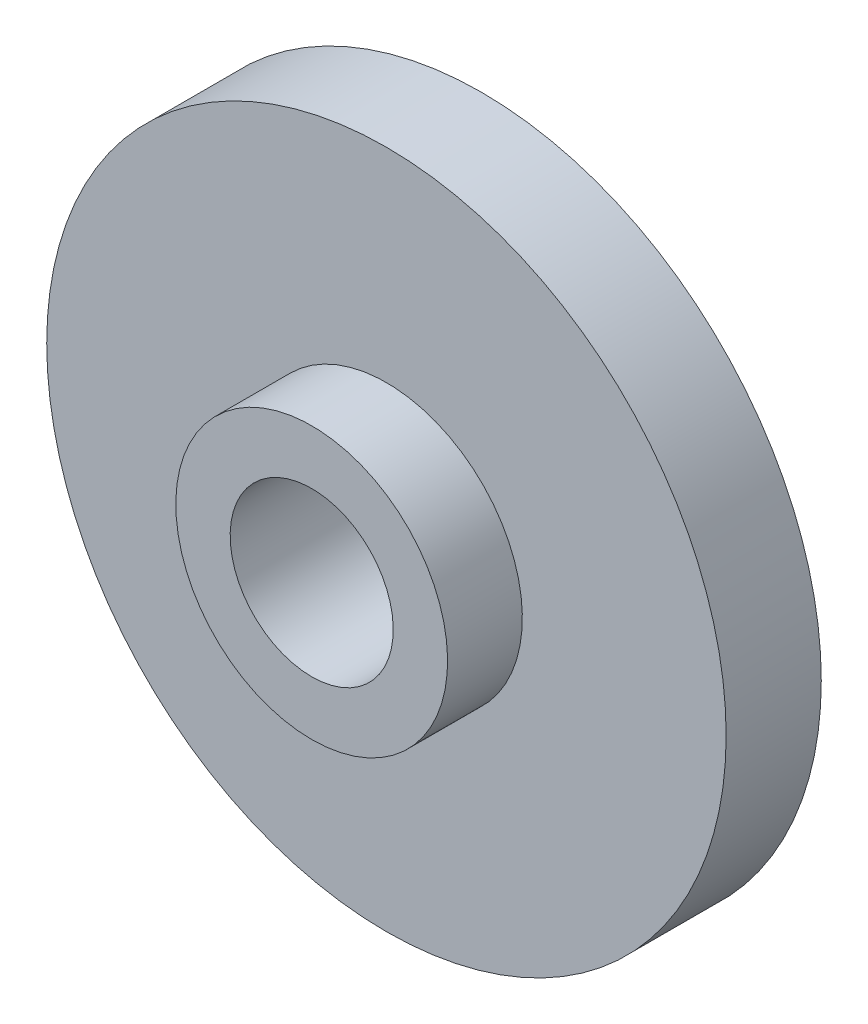
ISO-10303-21;
HEADER;
FILE_DESCRIPTION(('STEP AP214'),'2;1');
FILE_NAME('part.step','',(''),(''),'','','');
FILE_SCHEMA(('AUTOMOTIVE_DESIGN { 1 0 10303 214 1 1 1 1 }'));
ENDSEC;
DATA;
#1=APPLICATION_CONTEXT('core data for automotive mechanical design processes');
#2=APPLICATION_PROTOCOL_DEFINITION('international standard','automotive_design',2000,#1);
#3=PRODUCT_CONTEXT('',#1,'mechanical');
#4=PRODUCT('Part','Part','',(#3));
#5=PRODUCT_RELATED_PRODUCT_CATEGORY('part','',(#4));
#6=PRODUCT_DEFINITION_FORMATION('','',#4);
#7=PRODUCT_DEFINITION_CONTEXT('part definition',#1,'design');
#8=PRODUCT_DEFINITION('design','',#6,#7);
#9=PRODUCT_DEFINITION_SHAPE('','',#8);
#10=(LENGTH_UNIT() NAMED_UNIT(*) SI_UNIT(.MILLI.,.METRE.));
#11=(NAMED_UNIT(*) PLANE_ANGLE_UNIT() SI_UNIT($,.RADIAN.));
#12=(NAMED_UNIT(*) SI_UNIT($,.STERADIAN.) SOLID_ANGLE_UNIT());
#13=UNCERTAINTY_MEASURE_WITH_UNIT(LENGTH_MEASURE(1.E-05),#10,'distance_accuracy_value','');
#14=(GEOMETRIC_REPRESENTATION_CONTEXT(3) GLOBAL_UNCERTAINTY_ASSIGNED_CONTEXT((#13)) GLOBAL_UNIT_ASSIGNED_CONTEXT((#10,
#11,#12)) REPRESENTATION_CONTEXT('',''));
#15=CARTESIAN_POINT('',(0.,0.,0.));
#16=DIRECTION('',(0.,0.,1.));
#17=DIRECTION('',(1.,0.,0.));
#18=AXIS2_PLACEMENT_3D('',#15,#16,#17);
#19=CARTESIAN_POINT('',(0.,-5.,2.));
#20=DIRECTION('',(0.,0.,-1.));
#21=DIRECTION('',(0.,-1.,0.));
#22=AXIS2_PLACEMENT_3D('',#19,#20,#21);
#23=PLANE('',#22);
#24=CARTESIAN_POINT('',(0.,0.,2.));
#25=DIRECTION('',(0.,0.,1.));
#26=DIRECTION('',(1.,0.,0.));
#27=AXIS2_PLACEMENT_3D('',#24,#25,#26);
#28=CIRCLE('',#27,3.);
#29=CARTESIAN_POINT('',(0.,-3.,2.));
#30=VERTEX_POINT('',#29);
#31=EDGE_CURVE('E11',#30,#30,#28,.T.);
#32=ORIENTED_EDGE('',*,*,#31,.T.);
#33=EDGE_LOOP('',(#32));
#34=FACE_BOUND('',#33,.T.);
#35=CARTESIAN_POINT('',(0.,0.,2.));
#36=DIRECTION('',(0.,0.,1.));
#37=DIRECTION('',(1.,0.,0.));
#38=AXIS2_PLACEMENT_3D('',#35,#36,#37);
#39=CIRCLE('',#38,5.);
#40=CARTESIAN_POINT('',(0.,-5.,2.));
#41=VERTEX_POINT('',#40);
#42=EDGE_CURVE('E76',#41,#41,#39,.T.);
#43=ORIENTED_EDGE('',*,*,#42,.F.);
#44=EDGE_LOOP('',(#43));
#45=FACE_BOUND('',#44,.T.);
#46=ADVANCED_FACE('F17',(#34,#45),#23,.T.);
#47=CARTESIAN_POINT('',(0.,0.,6.5));
#48=DIRECTION('',(0.,0.,1.));
#49=DIRECTION('',(0.,-1.,0.));
#50=AXIS2_PLACEMENT_3D('',#47,#48,#49);
#51=CYLINDRICAL_SURFACE('',#50,3.);
#52=ORIENTED_EDGE('',*,*,#31,.F.);
#53=EDGE_LOOP('',(#52));
#54=FACE_BOUND('',#53,.T.);
#55=CARTESIAN_POINT('',(0.,0.,11.));
#56=DIRECTION('',(0.,0.,1.));
#57=DIRECTION('',(1.,0.,0.));
#58=AXIS2_PLACEMENT_3D('',#55,#56,#57);
#59=CIRCLE('',#58,3.);
#60=CARTESIAN_POINT('',(0.,-3.,11.));
#61=VERTEX_POINT('',#60);
#62=EDGE_CURVE('E28',#61,#61,#59,.T.);
#63=ORIENTED_EDGE('',*,*,#62,.T.);
#64=EDGE_LOOP('',(#63));
#65=FACE_BOUND('',#64,.T.);
#66=ADVANCED_FACE('F19',(#54,#65),#51,.F.);
#67=CARTESIAN_POINT('',(0.,-3.,11.));
#68=DIRECTION('',(0.,0.,1.));
#69=DIRECTION('',(1.,0.,0.));
#70=AXIS2_PLACEMENT_3D('',#67,#68,#69);
#71=PLANE('',#70);
#72=ORIENTED_EDGE('',*,*,#62,.F.);
#73=EDGE_LOOP('',(#72));
#74=FACE_BOUND('',#73,.T.);
#75=CARTESIAN_POINT('',(0.,0.,11.));
#76=DIRECTION('',(0.,0.,1.));
#77=DIRECTION('',(1.,0.,0.));
#78=AXIS2_PLACEMENT_3D('',#75,#76,#77);
#79=CIRCLE('',#78,5.);
#80=CARTESIAN_POINT('',(0.,-5.,11.));
#81=VERTEX_POINT('',#80);
#82=EDGE_CURVE('E21',#81,#81,#79,.T.);
#83=ORIENTED_EDGE('',*,*,#82,.T.);
#84=EDGE_LOOP('',(#83));
#85=FACE_BOUND('',#84,.T.);
#86=ADVANCED_FACE('F107',(#74,#85),#71,.T.);
#87=CARTESIAN_POINT('',(0.,0.,9.625));
#88=DIRECTION('',(0.,0.,1.));
#89=DIRECTION('',(0.,-1.,0.));
#90=AXIS2_PLACEMENT_3D('',#87,#88,#89);
#91=CYLINDRICAL_SURFACE('',#90,5.);
#92=ORIENTED_EDGE('',*,*,#82,.F.);
#93=EDGE_LOOP('',(#92));
#94=FACE_BOUND('',#93,.T.);
#95=CARTESIAN_POINT('',(0.,0.,8.25));
#96=DIRECTION('',(0.,0.,1.));
#97=DIRECTION('',(1.,0.,0.));
#98=AXIS2_PLACEMENT_3D('',#95,#96,#97);
#99=CIRCLE('',#98,5.);
#100=CARTESIAN_POINT('',(0.,-5.,8.25));
#101=VERTEX_POINT('',#100);
#102=EDGE_CURVE('E73',#101,#101,#99,.T.);
#103=ORIENTED_EDGE('',*,*,#102,.T.);
#104=EDGE_LOOP('',(#103));
#105=FACE_BOUND('',#104,.T.);
#106=ADVANCED_FACE('F111',(#94,#105),#91,.T.);
#107=CARTESIAN_POINT('',(0.,-5.,8.25));
#108=DIRECTION('',(0.,0.,1.));
#109=DIRECTION('',(1.,0.,0.));
#110=AXIS2_PLACEMENT_3D('',#107,#108,#109);
#111=PLANE('',#110);
#112=ORIENTED_EDGE('',*,*,#102,.F.);
#113=EDGE_LOOP('',(#112));
#114=FACE_BOUND('',#113,.T.);
#115=CARTESIAN_POINT('',(0.,0.,8.25));
#116=DIRECTION('',(0.,0.,1.));
#117=DIRECTION('',(1.,0.,0.));
#118=AXIS2_PLACEMENT_3D('',#115,#116,#117);
#119=CIRCLE('',#118,12.5);
#120=CARTESIAN_POINT('',(0.,-12.5,8.25));
#121=VERTEX_POINT('',#120);
#122=EDGE_CURVE('E58',#121,#121,#119,.T.);
#123=ORIENTED_EDGE('',*,*,#122,.T.);
#124=EDGE_LOOP('',(#123));
#125=FACE_BOUND('',#124,.T.);
#126=ADVANCED_FACE('F112',(#114,#125),#111,.T.);
#127=CARTESIAN_POINT('',(0.,0.,6.5));
#128=DIRECTION('',(0.,0.,1.));
#129=DIRECTION('',(0.,-1.,0.));
#130=AXIS2_PLACEMENT_3D('',#127,#128,#129);
#131=CYLINDRICAL_SURFACE('',#130,12.5);
#132=ORIENTED_EDGE('',*,*,#122,.F.);
#133=EDGE_LOOP('',(#132));
#134=FACE_BOUND('',#133,.T.);
#135=CARTESIAN_POINT('',(0.,0.,4.75));
#136=DIRECTION('',(0.,0.,1.));
#137=DIRECTION('',(1.,0.,0.));
#138=AXIS2_PLACEMENT_3D('',#135,#136,#137);
#139=CIRCLE('',#138,12.5);
#140=CARTESIAN_POINT('',(0.,-12.5,4.75));
#141=VERTEX_POINT('',#140);
#142=EDGE_CURVE('E64',#141,#141,#139,.T.);
#143=ORIENTED_EDGE('',*,*,#142,.T.);
#144=EDGE_LOOP('',(#143));
#145=FACE_BOUND('',#144,.T.);
#146=ADVANCED_FACE('F65',(#134,#145),#131,.T.);
#147=CARTESIAN_POINT('',(0.,-12.5,4.75));
#148=DIRECTION('',(0.,0.,-1.));
#149=DIRECTION('',(0.,-1.,0.));
#150=AXIS2_PLACEMENT_3D('',#147,#148,#149);
#151=PLANE('',#150);
#152=CARTESIAN_POINT('',(0.,0.,4.75));
#153=DIRECTION('',(0.,0.,1.));
#154=DIRECTION('',(1.,0.,0.));
#155=AXIS2_PLACEMENT_3D('',#152,#153,#154);
#156=CIRCLE('',#155,5.);
#157=CARTESIAN_POINT('',(0.,-5.,4.75));
#158=VERTEX_POINT('',#157);
#159=EDGE_CURVE('E68',#158,#158,#156,.T.);
#160=ORIENTED_EDGE('',*,*,#159,.T.);
#161=EDGE_LOOP('',(#160));
#162=FACE_BOUND('',#161,.T.);
#163=ORIENTED_EDGE('',*,*,#142,.F.);
#164=EDGE_LOOP('',(#163));
#165=FACE_BOUND('',#164,.T.);
#166=ADVANCED_FACE('F116',(#162,#165),#151,.T.);
#167=CARTESIAN_POINT('',(0.,0.,3.375));
#168=DIRECTION('',(0.,0.,1.));
#169=DIRECTION('',(0.,-1.,0.));
#170=AXIS2_PLACEMENT_3D('',#167,#168,#169);
#171=CYLINDRICAL_SURFACE('',#170,5.);
#172=ORIENTED_EDGE('',*,*,#159,.F.);
#173=EDGE_LOOP('',(#172));
#174=FACE_BOUND('',#173,.T.);
#175=ORIENTED_EDGE('',*,*,#42,.T.);
#176=EDGE_LOOP('',(#175));
#177=FACE_BOUND('',#176,.T.);
#178=ADVANCED_FACE('F98',(#174,#177),#171,.T.);
#179=CLOSED_SHELL('',(#46,#66,#86,#106,#126,#146,#166,#178));
#180=MANIFOLD_SOLID_BREP('B1',#179);
#181=ADVANCED_BREP_SHAPE_REPRESENTATION('',(#18,#180),#14);
#182=SHAPE_DEFINITION_REPRESENTATION(#9,#181);
ENDSEC;
END-ISO-10303-21;
